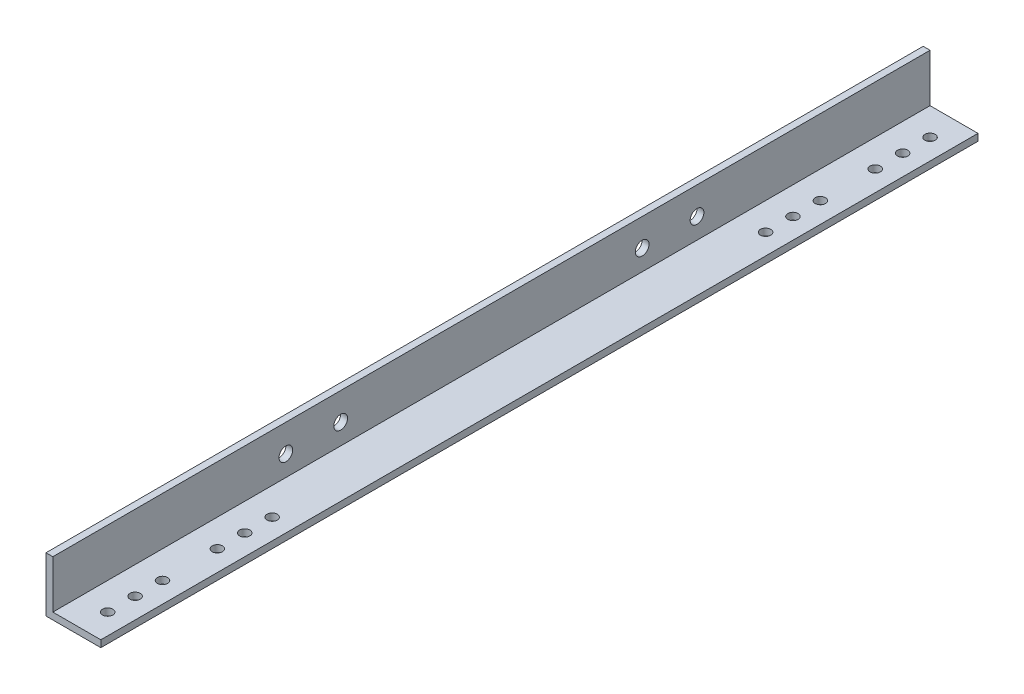
ISO-10303-21;
HEADER;
FILE_DESCRIPTION(('STEP AP214'),'2;1');
FILE_NAME('part.step','',(''),(''),'','','');
FILE_SCHEMA(('AUTOMOTIVE_DESIGN { 1 0 10303 214 1 1 1 1 }'));
ENDSEC;
DATA;
#1=APPLICATION_CONTEXT('core data for automotive mechanical design processes');
#2=APPLICATION_PROTOCOL_DEFINITION('international standard','automotive_design',2000,#1);
#3=PRODUCT_CONTEXT('',#1,'mechanical');
#4=PRODUCT('Part','Part','',(#3));
#5=PRODUCT_RELATED_PRODUCT_CATEGORY('part','',(#4));
#6=PRODUCT_DEFINITION_FORMATION('','',#4);
#7=PRODUCT_DEFINITION_CONTEXT('part definition',#1,'design');
#8=PRODUCT_DEFINITION('design','',#6,#7);
#9=PRODUCT_DEFINITION_SHAPE('','',#8);
#10=(LENGTH_UNIT() NAMED_UNIT(*) SI_UNIT(.MILLI.,.METRE.));
#11=(NAMED_UNIT(*) PLANE_ANGLE_UNIT() SI_UNIT($,.RADIAN.));
#12=(NAMED_UNIT(*) SI_UNIT($,.STERADIAN.) SOLID_ANGLE_UNIT());
#13=UNCERTAINTY_MEASURE_WITH_UNIT(LENGTH_MEASURE(1.E-05),#10,'distance_accuracy_value','');
#14=(GEOMETRIC_REPRESENTATION_CONTEXT(3) GLOBAL_UNCERTAINTY_ASSIGNED_CONTEXT((#13)) GLOBAL_UNIT_ASSIGNED_CONTEXT((#10,
#11,#12)) REPRESENTATION_CONTEXT('',''));
#15=CARTESIAN_POINT('',(0.,0.,0.));
#16=DIRECTION('',(0.,0.,1.));
#17=DIRECTION('',(1.,0.,0.));
#18=AXIS2_PLACEMENT_3D('',#15,#16,#17);
#19=CARTESIAN_POINT('',(15.875,0.,381.));
#20=DIRECTION('',(0.,1.,0.));
#21=DIRECTION('',(-1.,0.,0.));
#22=AXIS2_PLACEMENT_3D('',#19,#20,#21);
#23=CYLINDRICAL_SURFACE('',#22,2.38125000000002);
#24=CARTESIAN_POINT('',(15.875,0.,381.));
#25=DIRECTION('',(0.,1.,0.));
#26=DIRECTION('',(-1.,0.,0.));
#27=AXIS2_PLACEMENT_3D('',#24,#25,#26);
#28=CIRCLE('',#27,2.38125000000002);
#29=CARTESIAN_POINT('',(13.49375,0.,381.));
#30=VERTEX_POINT('',#29);
#31=EDGE_CURVE('E161',#30,#30,#28,.F.);
#32=ORIENTED_EDGE('',*,*,#31,.T.);
#33=EDGE_LOOP('',(#32));
#34=FACE_BOUND('',#33,.T.);
#35=CARTESIAN_POINT('',(15.875,3.17499999999999,381.));
#36=DIRECTION('',(0.,1.,0.));
#37=DIRECTION('',(-1.,0.,0.));
#38=AXIS2_PLACEMENT_3D('',#35,#36,#37);
#39=CIRCLE('',#38,2.38125000000002);
#40=CARTESIAN_POINT('',(13.49375,3.17499999999999,381.));
#41=VERTEX_POINT('',#40);
#42=EDGE_CURVE('E20',#41,#41,#39,.T.);
#43=ORIENTED_EDGE('',*,*,#42,.T.);
#44=EDGE_LOOP('',(#43));
#45=FACE_BOUND('',#44,.T.);
#46=ADVANCED_FACE('F17',(#34,#45),#23,.F.);
#47=CARTESIAN_POINT('',(15.875,0.,342.9));
#48=DIRECTION('',(0.,1.,0.));
#49=DIRECTION('',(-1.,0.,0.));
#50=AXIS2_PLACEMENT_3D('',#47,#48,#49);
#51=CYLINDRICAL_SURFACE('',#50,2.38125000000002);
#52=CARTESIAN_POINT('',(15.875,3.17499999999999,342.9));
#53=DIRECTION('',(0.,1.,0.));
#54=DIRECTION('',(-1.,0.,0.));
#55=AXIS2_PLACEMENT_3D('',#52,#53,#54);
#56=CIRCLE('',#55,2.38125000000002);
#57=CARTESIAN_POINT('',(13.49375,3.17499999999999,342.9));
#58=VERTEX_POINT('',#57);
#59=EDGE_CURVE('E190',#58,#58,#56,.T.);
#60=ORIENTED_EDGE('',*,*,#59,.T.);
#61=EDGE_LOOP('',(#60));
#62=FACE_BOUND('',#61,.T.);
#63=CARTESIAN_POINT('',(15.875,0.,342.9));
#64=DIRECTION('',(0.,1.,0.));
#65=DIRECTION('',(-1.,0.,0.));
#66=AXIS2_PLACEMENT_3D('',#63,#64,#65);
#67=CIRCLE('',#66,2.38125000000002);
#68=CARTESIAN_POINT('',(13.49375,0.,342.9));
#69=VERTEX_POINT('',#68);
#70=EDGE_CURVE('E158',#69,#69,#67,.F.);
#71=ORIENTED_EDGE('',*,*,#70,.T.);
#72=EDGE_LOOP('',(#71));
#73=FACE_BOUND('',#72,.T.);
#74=ADVANCED_FACE('F291',(#62,#73),#51,.F.);
#75=CARTESIAN_POINT('',(15.875,0.,330.2));
#76=DIRECTION('',(0.,1.,0.));
#77=DIRECTION('',(-1.,0.,0.));
#78=AXIS2_PLACEMENT_3D('',#75,#76,#77);
#79=CYLINDRICAL_SURFACE('',#78,2.38125000000002);
#80=CARTESIAN_POINT('',(15.875,3.17499999999999,330.2));
#81=DIRECTION('',(0.,1.,0.));
#82=DIRECTION('',(-1.,0.,0.));
#83=AXIS2_PLACEMENT_3D('',#80,#81,#82);
#84=CIRCLE('',#83,2.38125000000002);
#85=CARTESIAN_POINT('',(13.49375,3.17499999999999,330.2));
#86=VERTEX_POINT('',#85);
#87=EDGE_CURVE('E188',#86,#86,#84,.T.);
#88=ORIENTED_EDGE('',*,*,#87,.T.);
#89=EDGE_LOOP('',(#88));
#90=FACE_BOUND('',#89,.T.);
#91=CARTESIAN_POINT('',(15.875,0.,330.2));
#92=DIRECTION('',(0.,1.,0.));
#93=DIRECTION('',(-1.,0.,0.));
#94=AXIS2_PLACEMENT_3D('',#91,#92,#93);
#95=CIRCLE('',#94,2.38125000000002);
#96=CARTESIAN_POINT('',(13.49375,0.,330.2));
#97=VERTEX_POINT('',#96);
#98=EDGE_CURVE('E155',#97,#97,#95,.F.);
#99=ORIENTED_EDGE('',*,*,#98,.T.);
#100=EDGE_LOOP('',(#99));
#101=FACE_BOUND('',#100,.T.);
#102=ADVANCED_FACE('F295',(#90,#101),#79,.F.);
#103=CARTESIAN_POINT('',(15.875,0.,317.5));
#104=DIRECTION('',(0.,1.,0.));
#105=DIRECTION('',(-1.,0.,0.));
#106=AXIS2_PLACEMENT_3D('',#103,#104,#105);
#107=CYLINDRICAL_SURFACE('',#106,2.38125000000003);
#108=CARTESIAN_POINT('',(15.875,3.17499999999999,317.5));
#109=DIRECTION('',(0.,1.,0.));
#110=DIRECTION('',(-1.,0.,0.));
#111=AXIS2_PLACEMENT_3D('',#108,#109,#110);
#112=CIRCLE('',#111,2.38125000000003);
#113=CARTESIAN_POINT('',(13.49375,3.17499999999999,317.5));
#114=VERTEX_POINT('',#113);
#115=EDGE_CURVE('E185',#114,#114,#112,.T.);
#116=ORIENTED_EDGE('',*,*,#115,.T.);
#117=EDGE_LOOP('',(#116));
#118=FACE_BOUND('',#117,.T.);
#119=CARTESIAN_POINT('',(15.875,0.,317.5));
#120=DIRECTION('',(0.,1.,0.));
#121=DIRECTION('',(-1.,0.,0.));
#122=AXIS2_PLACEMENT_3D('',#119,#120,#121);
#123=CIRCLE('',#122,2.38125000000003);
#124=CARTESIAN_POINT('',(13.49375,0.,317.5));
#125=VERTEX_POINT('',#124);
#126=EDGE_CURVE('E152',#125,#125,#123,.F.);
#127=ORIENTED_EDGE('',*,*,#126,.T.);
#128=EDGE_LOOP('',(#127));
#129=FACE_BOUND('',#128,.T.);
#130=ADVANCED_FACE('F299',(#118,#129),#107,.F.);
#131=CARTESIAN_POINT('',(15.875,0.,76.2));
#132=DIRECTION('',(0.,1.,0.));
#133=DIRECTION('',(-1.,0.,0.));
#134=AXIS2_PLACEMENT_3D('',#131,#132,#133);
#135=CYLINDRICAL_SURFACE('',#134,2.38125);
#136=CARTESIAN_POINT('',(15.875,0.,76.2));
#137=DIRECTION('',(0.,1.,0.));
#138=DIRECTION('',(-1.,0.,0.));
#139=AXIS2_PLACEMENT_3D('',#136,#137,#138);
#140=CIRCLE('',#139,2.38125);
#141=CARTESIAN_POINT('',(13.49375,0.,76.2));
#142=VERTEX_POINT('',#141);
#143=EDGE_CURVE('E149',#142,#142,#140,.F.);
#144=ORIENTED_EDGE('',*,*,#143,.T.);
#145=EDGE_LOOP('',(#144));
#146=FACE_BOUND('',#145,.T.);
#147=CARTESIAN_POINT('',(15.875,3.17499999999999,76.2));
#148=DIRECTION('',(0.,1.,0.));
#149=DIRECTION('',(-1.,0.,0.));
#150=AXIS2_PLACEMENT_3D('',#147,#148,#149);
#151=CIRCLE('',#150,2.38125);
#152=CARTESIAN_POINT('',(13.49375,3.17499999999999,76.2));
#153=VERTEX_POINT('',#152);
#154=EDGE_CURVE('E88',#153,#153,#151,.T.);
#155=ORIENTED_EDGE('',*,*,#154,.T.);
#156=EDGE_LOOP('',(#155));
#157=FACE_BOUND('',#156,.T.);
#158=ADVANCED_FACE('F306',(#146,#157),#135,.F.);
#159=CARTESIAN_POINT('',(15.875,0.,393.7));
#160=DIRECTION('',(0.,1.,0.));
#161=DIRECTION('',(-1.,0.,0.));
#162=AXIS2_PLACEMENT_3D('',#159,#160,#161);
#163=CYLINDRICAL_SURFACE('',#162,2.38125000000003);
#164=CARTESIAN_POINT('',(15.875,0.,393.7));
#165=DIRECTION('',(0.,1.,0.));
#166=DIRECTION('',(-1.,0.,0.));
#167=AXIS2_PLACEMENT_3D('',#164,#165,#166);
#168=CIRCLE('',#167,2.38125000000003);
#169=CARTESIAN_POINT('',(13.49375,0.,393.7));
#170=VERTEX_POINT('',#169);
#171=EDGE_CURVE('E145',#170,#170,#168,.F.);
#172=ORIENTED_EDGE('',*,*,#171,.T.);
#173=EDGE_LOOP('',(#172));
#174=FACE_BOUND('',#173,.T.);
#175=CARTESIAN_POINT('',(15.875,3.17499999999999,393.7));
#176=DIRECTION('',(0.,1.,0.));
#177=DIRECTION('',(-1.,0.,0.));
#178=AXIS2_PLACEMENT_3D('',#175,#176,#177);
#179=CIRCLE('',#178,2.38125000000003);
#180=CARTESIAN_POINT('',(13.49375,3.17499999999999,393.7));
#181=VERTEX_POINT('',#180);
#182=EDGE_CURVE('E87',#181,#181,#179,.T.);
#183=ORIENTED_EDGE('',*,*,#182,.T.);
#184=EDGE_LOOP('',(#183));
#185=FACE_BOUND('',#184,.T.);
#186=ADVANCED_FACE('F310',(#174,#185),#163,.F.);
#187=CARTESIAN_POINT('',(15.875,0.,12.7));
#188=DIRECTION('',(0.,1.,0.));
#189=DIRECTION('',(-1.,0.,0.));
#190=AXIS2_PLACEMENT_3D('',#187,#188,#189);
#191=CYLINDRICAL_SURFACE('',#190,2.38125000000001);
#192=CARTESIAN_POINT('',(15.875,3.17499999999999,12.7));
#193=DIRECTION('',(0.,1.,0.));
#194=DIRECTION('',(-1.,0.,0.));
#195=AXIS2_PLACEMENT_3D('',#192,#193,#194);
#196=CIRCLE('',#195,2.38125000000001);
#197=CARTESIAN_POINT('',(13.49375,3.17499999999999,12.7));
#198=VERTEX_POINT('',#197);
#199=EDGE_CURVE('E178',#198,#198,#196,.T.);
#200=ORIENTED_EDGE('',*,*,#199,.T.);
#201=EDGE_LOOP('',(#200));
#202=FACE_BOUND('',#201,.T.);
#203=CARTESIAN_POINT('',(15.875,0.,12.7));
#204=DIRECTION('',(0.,1.,0.));
#205=DIRECTION('',(-1.,0.,0.));
#206=AXIS2_PLACEMENT_3D('',#203,#204,#205);
#207=CIRCLE('',#206,2.38125000000001);
#208=CARTESIAN_POINT('',(13.49375,0.,12.7));
#209=VERTEX_POINT('',#208);
#210=EDGE_CURVE('E142',#209,#209,#207,.F.);
#211=ORIENTED_EDGE('',*,*,#210,.T.);
#212=EDGE_LOOP('',(#211));
#213=FACE_BOUND('',#212,.T.);
#214=ADVANCED_FACE('F314',(#202,#213),#191,.F.);
#215=CARTESIAN_POINT('',(15.875,0.,25.4));
#216=DIRECTION('',(0.,1.,0.));
#217=DIRECTION('',(-1.,0.,0.));
#218=AXIS2_PLACEMENT_3D('',#215,#216,#217);
#219=CYLINDRICAL_SURFACE('',#218,2.38125);
#220=CARTESIAN_POINT('',(15.875,3.17499999999999,25.4));
#221=DIRECTION('',(0.,1.,0.));
#222=DIRECTION('',(-1.,0.,0.));
#223=AXIS2_PLACEMENT_3D('',#220,#221,#222);
#224=CIRCLE('',#223,2.38125);
#225=CARTESIAN_POINT('',(13.49375,3.17499999999999,25.4));
#226=VERTEX_POINT('',#225);
#227=EDGE_CURVE('E175',#226,#226,#224,.T.);
#228=ORIENTED_EDGE('',*,*,#227,.T.);
#229=EDGE_LOOP('',(#228));
#230=FACE_BOUND('',#229,.T.);
#231=CARTESIAN_POINT('',(15.875,0.,25.4));
#232=DIRECTION('',(0.,1.,0.));
#233=DIRECTION('',(-1.,0.,0.));
#234=AXIS2_PLACEMENT_3D('',#231,#232,#233);
#235=CIRCLE('',#234,2.38125);
#236=CARTESIAN_POINT('',(13.49375,0.,25.4));
#237=VERTEX_POINT('',#236);
#238=EDGE_CURVE('E139',#237,#237,#235,.F.);
#239=ORIENTED_EDGE('',*,*,#238,.T.);
#240=EDGE_LOOP('',(#239));
#241=FACE_BOUND('',#240,.T.);
#242=ADVANCED_FACE('F318',(#230,#241),#219,.F.);
#243=CARTESIAN_POINT('',(15.875,0.,38.1));
#244=DIRECTION('',(0.,1.,0.));
#245=DIRECTION('',(-1.,0.,0.));
#246=AXIS2_PLACEMENT_3D('',#243,#244,#245);
#247=CYLINDRICAL_SURFACE('',#246,2.38125000000001);
#248=CARTESIAN_POINT('',(15.875,3.17499999999999,38.1));
#249=DIRECTION('',(0.,1.,0.));
#250=DIRECTION('',(-1.,0.,0.));
#251=AXIS2_PLACEMENT_3D('',#248,#249,#250);
#252=CIRCLE('',#251,2.38125000000001);
#253=CARTESIAN_POINT('',(13.49375,3.17499999999999,38.1));
#254=VERTEX_POINT('',#253);
#255=EDGE_CURVE('E172',#254,#254,#252,.T.);
#256=ORIENTED_EDGE('',*,*,#255,.T.);
#257=EDGE_LOOP('',(#256));
#258=FACE_BOUND('',#257,.T.);
#259=CARTESIAN_POINT('',(15.875,0.,38.1));
#260=DIRECTION('',(0.,1.,0.));
#261=DIRECTION('',(-1.,0.,0.));
#262=AXIS2_PLACEMENT_3D('',#259,#260,#261);
#263=CIRCLE('',#262,2.38125000000001);
#264=CARTESIAN_POINT('',(13.49375,0.,38.1));
#265=VERTEX_POINT('',#264);
#266=EDGE_CURVE('E136',#265,#265,#263,.F.);
#267=ORIENTED_EDGE('',*,*,#266,.T.);
#268=EDGE_LOOP('',(#267));
#269=FACE_BOUND('',#268,.T.);
#270=ADVANCED_FACE('F322',(#258,#269),#247,.F.);
#271=CARTESIAN_POINT('',(15.875,0.,63.5000000000001));
#272=DIRECTION('',(0.,1.,0.));
#273=DIRECTION('',(-1.,0.,0.));
#274=AXIS2_PLACEMENT_3D('',#271,#272,#273);
#275=CYLINDRICAL_SURFACE('',#274,2.38125);
#276=CARTESIAN_POINT('',(15.875,0.,63.5000000000001));
#277=DIRECTION('',(0.,1.,0.));
#278=DIRECTION('',(-1.,0.,0.));
#279=AXIS2_PLACEMENT_3D('',#276,#277,#278);
#280=CIRCLE('',#279,2.38125);
#281=CARTESIAN_POINT('',(13.49375,0.,63.5000000000001));
#282=VERTEX_POINT('',#281);
#283=EDGE_CURVE('E133',#282,#282,#280,.F.);
#284=ORIENTED_EDGE('',*,*,#283,.T.);
#285=EDGE_LOOP('',(#284));
#286=FACE_BOUND('',#285,.T.);
#287=CARTESIAN_POINT('',(15.875,3.17499999999999,63.5000000000001));
#288=DIRECTION('',(0.,1.,0.));
#289=DIRECTION('',(-1.,0.,0.));
#290=AXIS2_PLACEMENT_3D('',#287,#288,#289);
#291=CIRCLE('',#290,2.38125);
#292=CARTESIAN_POINT('',(13.49375,3.17499999999999,63.5000000000001));
#293=VERTEX_POINT('',#292);
#294=EDGE_CURVE('E169',#293,#293,#291,.T.);
#295=ORIENTED_EDGE('',*,*,#294,.T.);
#296=EDGE_LOOP('',(#295));
#297=FACE_BOUND('',#296,.T.);
#298=ADVANCED_FACE('F326',(#286,#297),#275,.F.);
#299=CARTESIAN_POINT('',(15.875,0.,88.9));
#300=DIRECTION('',(0.,1.,0.));
#301=DIRECTION('',(-1.,0.,0.));
#302=AXIS2_PLACEMENT_3D('',#299,#300,#301);
#303=CYLINDRICAL_SURFACE('',#302,2.38125000000001);
#304=CARTESIAN_POINT('',(15.875,0.,88.9));
#305=DIRECTION('',(0.,1.,0.));
#306=DIRECTION('',(-1.,0.,0.));
#307=AXIS2_PLACEMENT_3D('',#304,#305,#306);
#308=CIRCLE('',#307,2.38125000000001);
#309=CARTESIAN_POINT('',(13.49375,0.,88.9));
#310=VERTEX_POINT('',#309);
#311=EDGE_CURVE('E130',#310,#310,#308,.F.);
#312=ORIENTED_EDGE('',*,*,#311,.T.);
#313=EDGE_LOOP('',(#312));
#314=FACE_BOUND('',#313,.T.);
#315=CARTESIAN_POINT('',(15.875,3.17499999999999,88.9));
#316=DIRECTION('',(0.,1.,0.));
#317=DIRECTION('',(-1.,0.,0.));
#318=AXIS2_PLACEMENT_3D('',#315,#316,#317);
#319=CIRCLE('',#318,2.38125000000001);
#320=CARTESIAN_POINT('',(13.49375,3.17499999999999,88.9));
#321=VERTEX_POINT('',#320);
#322=EDGE_CURVE('E166',#321,#321,#319,.T.);
#323=ORIENTED_EDGE('',*,*,#322,.T.);
#324=EDGE_LOOP('',(#323));
#325=FACE_BOUND('',#324,.T.);
#326=ADVANCED_FACE('F330',(#314,#325),#303,.F.);
#327=CARTESIAN_POINT('',(15.875,0.,368.3));
#328=DIRECTION('',(0.,1.,0.));
#329=DIRECTION('',(-1.,0.,0.));
#330=AXIS2_PLACEMENT_3D('',#327,#328,#329);
#331=CYLINDRICAL_SURFACE('',#330,2.38125000000002);
#332=CARTESIAN_POINT('',(15.875,0.,368.3));
#333=DIRECTION('',(0.,1.,0.));
#334=DIRECTION('',(-1.,0.,0.));
#335=AXIS2_PLACEMENT_3D('',#332,#333,#334);
#336=CIRCLE('',#335,2.38125000000002);
#337=CARTESIAN_POINT('',(13.49375,0.,368.3));
#338=VERTEX_POINT('',#337);
#339=EDGE_CURVE('E127',#338,#338,#336,.F.);
#340=ORIENTED_EDGE('',*,*,#339,.T.);
#341=EDGE_LOOP('',(#340));
#342=FACE_BOUND('',#341,.T.);
#343=CARTESIAN_POINT('',(15.875,3.17499999999999,368.3));
#344=DIRECTION('',(0.,1.,0.));
#345=DIRECTION('',(-1.,0.,0.));
#346=AXIS2_PLACEMENT_3D('',#343,#344,#345);
#347=CIRCLE('',#346,2.38125000000002);
#348=CARTESIAN_POINT('',(13.49375,3.17499999999999,368.3));
#349=VERTEX_POINT('',#348);
#350=EDGE_CURVE('E102',#349,#349,#347,.T.);
#351=ORIENTED_EDGE('',*,*,#350,.T.);
#352=EDGE_LOOP('',(#351));
#353=FACE_BOUND('',#352,.T.);
#354=ADVANCED_FACE('F210',(#342,#353),#331,.F.);
#355=CARTESIAN_POINT('',(25.4,0.,406.4));
#356=DIRECTION('',(-1.,0.,0.));
#357=DIRECTION('',(0.,0.,1.));
#358=AXIS2_PLACEMENT_3D('',#355,#356,#357);
#359=PLANE('',#358);
#360=DIRECTION('',(0.,0.,1.));
#361=VECTOR('',#360,1.);
#362=CARTESIAN_POINT('',(25.4,3.175,406.4));
#363=LINE('',#362,#361);
#364=CARTESIAN_POINT('',(25.4,3.175,0.));
#365=VERTEX_POINT('',#364);
#366=CARTESIAN_POINT('',(25.4,3.175,406.4));
#367=VERTEX_POINT('',#366);
#368=EDGE_CURVE('E81',#365,#367,#363,.T.);
#369=ORIENTED_EDGE('',*,*,#368,.T.);
#370=DIRECTION('',(0.,1.,0.));
#371=VECTOR('',#370,1.);
#372=CARTESIAN_POINT('',(25.4,0.,406.4));
#373=LINE('',#372,#371);
#374=CARTESIAN_POINT('',(25.4,0.,406.4));
#375=VERTEX_POINT('',#374);
#376=EDGE_CURVE('E71',#375,#367,#373,.T.);
#377=ORIENTED_EDGE('',*,*,#376,.F.);
#378=DIRECTION('',(0.,0.,1.));
#379=VECTOR('',#378,1.);
#380=CARTESIAN_POINT('',(25.4,0.,406.4));
#381=LINE('',#380,#379);
#382=CARTESIAN_POINT('',(25.4,0.,0.));
#383=VERTEX_POINT('',#382);
#384=EDGE_CURVE('E148',#375,#383,#381,.F.);
#385=ORIENTED_EDGE('',*,*,#384,.T.);
#386=DIRECTION('',(0.,1.,0.));
#387=VECTOR('',#386,1.);
#388=CARTESIAN_POINT('',(25.4,0.,0.));
#389=LINE('',#388,#387);
#390=EDGE_CURVE('E83',#383,#365,#389,.T.);
#391=ORIENTED_EDGE('',*,*,#390,.T.);
#392=EDGE_LOOP('',(#369,#377,#385,#391));
#393=FACE_BOUND('',#392,.T.);
#394=ADVANCED_FACE('F82',(#393),#359,.F.);
#395=CARTESIAN_POINT('',(25.4,3.175,406.4));
#396=DIRECTION('',(0.,-1.,0.));
#397=DIRECTION('',(1.,0.,0.));
#398=AXIS2_PLACEMENT_3D('',#395,#396,#397);
#399=PLANE('',#398);
#400=ORIENTED_EDGE('',*,*,#350,.F.);
#401=EDGE_LOOP('',(#400));
#402=FACE_BOUND('',#401,.T.);
#403=ORIENTED_EDGE('',*,*,#322,.F.);
#404=EDGE_LOOP('',(#403));
#405=FACE_BOUND('',#404,.T.);
#406=ORIENTED_EDGE('',*,*,#294,.F.);
#407=EDGE_LOOP('',(#406));
#408=FACE_BOUND('',#407,.T.);
#409=ORIENTED_EDGE('',*,*,#255,.F.);
#410=EDGE_LOOP('',(#409));
#411=FACE_BOUND('',#410,.T.);
#412=ORIENTED_EDGE('',*,*,#227,.F.);
#413=EDGE_LOOP('',(#412));
#414=FACE_BOUND('',#413,.T.);
#415=ORIENTED_EDGE('',*,*,#199,.F.);
#416=EDGE_LOOP('',(#415));
#417=FACE_BOUND('',#416,.T.);
#418=ORIENTED_EDGE('',*,*,#182,.F.);
#419=EDGE_LOOP('',(#418));
#420=FACE_BOUND('',#419,.T.);
#421=DIRECTION('',(0.,0.,1.));
#422=VECTOR('',#421,1.);
#423=CARTESIAN_POINT('',(3.175,3.17499999999999,406.4));
#424=LINE('',#423,#422);
#425=CARTESIAN_POINT('',(3.175,3.175,0.));
#426=VERTEX_POINT('',#425);
#427=CARTESIAN_POINT('',(3.175,3.175,406.4));
#428=VERTEX_POINT('',#427);
#429=EDGE_CURVE('E92',#426,#428,#424,.T.);
#430=ORIENTED_EDGE('',*,*,#429,.T.);
#431=DIRECTION('',(1.,0.,0.));
#432=VECTOR('',#431,1.);
#433=CARTESIAN_POINT('',(0.,3.175,406.4));
#434=LINE('',#433,#432);
#435=EDGE_CURVE('E68',#367,#428,#434,.F.);
#436=ORIENTED_EDGE('',*,*,#435,.F.);
#437=ORIENTED_EDGE('',*,*,#368,.F.);
#438=DIRECTION('',(1.,0.,0.));
#439=VECTOR('',#438,1.);
#440=CARTESIAN_POINT('',(0.,3.175,0.));
#441=LINE('',#440,#439);
#442=EDGE_CURVE('E268',#365,#426,#441,.F.);
#443=ORIENTED_EDGE('',*,*,#442,.T.);
#444=EDGE_LOOP('',(#430,#436,#437,#443));
#445=FACE_BOUND('',#444,.T.);
#446=ORIENTED_EDGE('',*,*,#154,.F.);
#447=EDGE_LOOP('',(#446));
#448=FACE_BOUND('',#447,.T.);
#449=ORIENTED_EDGE('',*,*,#115,.F.);
#450=EDGE_LOOP('',(#449));
#451=FACE_BOUND('',#450,.T.);
#452=ORIENTED_EDGE('',*,*,#87,.F.);
#453=EDGE_LOOP('',(#452));
#454=FACE_BOUND('',#453,.T.);
#455=ORIENTED_EDGE('',*,*,#59,.F.);
#456=EDGE_LOOP('',(#455));
#457=FACE_BOUND('',#456,.T.);
#458=ORIENTED_EDGE('',*,*,#42,.F.);
#459=EDGE_LOOP('',(#458));
#460=FACE_BOUND('',#459,.T.);
#461=ADVANCED_FACE('F90',(#402,#405,#408,#411,#414,#417,#420,#445,#448,#451,#454,#457,#460),
#399,.F.);
#462=CARTESIAN_POINT('',(3.175,3.17499999999999,406.4));
#463=DIRECTION('',(-1.,0.,0.));
#464=DIRECTION('',(0.,-1.,0.));
#465=AXIS2_PLACEMENT_3D('',#462,#463,#464);
#466=PLANE('',#465);
#467=CARTESIAN_POINT('',(3.175,12.7,133.35));
#468=DIRECTION('',(-1.,0.,0.));
#469=DIRECTION('',(0.,0.,1.));
#470=AXIS2_PLACEMENT_3D('',#467,#468,#469);
#471=CIRCLE('',#470,3.17500000000001);
#472=CARTESIAN_POINT('',(3.175,12.7,136.525));
#473=VERTEX_POINT('',#472);
#474=EDGE_CURVE('E113',#473,#473,#471,.T.);
#475=ORIENTED_EDGE('',*,*,#474,.T.);
#476=EDGE_LOOP('',(#475));
#477=FACE_BOUND('',#476,.T.);
#478=CARTESIAN_POINT('',(3.175,12.7,298.45));
#479=DIRECTION('',(-1.,0.,0.));
#480=DIRECTION('',(0.,0.,1.));
#481=AXIS2_PLACEMENT_3D('',#478,#479,#480);
#482=CIRCLE('',#481,3.17500000000004);
#483=CARTESIAN_POINT('',(3.175,12.7,301.625));
#484=VERTEX_POINT('',#483);
#485=EDGE_CURVE('E117',#484,#484,#482,.T.);
#486=ORIENTED_EDGE('',*,*,#485,.T.);
#487=EDGE_LOOP('',(#486));
#488=FACE_BOUND('',#487,.T.);
#489=CARTESIAN_POINT('',(3.175,12.7,273.05));
#490=DIRECTION('',(-1.,0.,0.));
#491=DIRECTION('',(0.,0.,1.));
#492=AXIS2_PLACEMENT_3D('',#489,#490,#491);
#493=CIRCLE('',#492,3.17500000000004);
#494=CARTESIAN_POINT('',(3.175,12.7,276.225));
#495=VERTEX_POINT('',#494);
#496=EDGE_CURVE('E120',#495,#495,#493,.T.);
#497=ORIENTED_EDGE('',*,*,#496,.T.);
#498=EDGE_LOOP('',(#497));
#499=FACE_BOUND('',#498,.T.);
#500=CARTESIAN_POINT('',(3.175,12.7,107.95));
#501=DIRECTION('',(-1.,0.,0.));
#502=DIRECTION('',(0.,0.,1.));
#503=AXIS2_PLACEMENT_3D('',#500,#501,#502);
#504=CIRCLE('',#503,3.175);
#505=CARTESIAN_POINT('',(3.175,12.7,111.125));
#506=VERTEX_POINT('',#505);
#507=EDGE_CURVE('E123',#506,#506,#504,.T.);
#508=ORIENTED_EDGE('',*,*,#507,.T.);
#509=EDGE_LOOP('',(#508));
#510=FACE_BOUND('',#509,.T.);
#511=DIRECTION('',(0.,0.,-1.));
#512=VECTOR('',#511,1.);
#513=CARTESIAN_POINT('',(3.175,25.4,406.4));
#514=LINE('',#513,#512);
#515=CARTESIAN_POINT('',(3.175,25.4,0.));
#516=VERTEX_POINT('',#515);
#517=CARTESIAN_POINT('',(3.175,25.4,406.4));
#518=VERTEX_POINT('',#517);
#519=EDGE_CURVE('E78',#516,#518,#514,.F.);
#520=ORIENTED_EDGE('',*,*,#519,.T.);
#521=DIRECTION('',(0.,1.,0.));
#522=VECTOR('',#521,1.);
#523=CARTESIAN_POINT('',(3.175,0.,406.4));
#524=LINE('',#523,#522);
#525=EDGE_CURVE('E94',#428,#518,#524,.T.);
#526=ORIENTED_EDGE('',*,*,#525,.F.);
#527=ORIENTED_EDGE('',*,*,#429,.F.);
#528=DIRECTION('',(0.,1.,0.));
#529=VECTOR('',#528,1.);
#530=CARTESIAN_POINT('',(3.175,0.,0.));
#531=LINE('',#530,#529);
#532=EDGE_CURVE('E265',#426,#516,#531,.T.);
#533=ORIENTED_EDGE('',*,*,#532,.T.);
#534=EDGE_LOOP('',(#520,#526,#527,#533));
#535=FACE_BOUND('',#534,.T.);
#536=ADVANCED_FACE('F199',(#477,#488,#499,#510,#535),#466,.F.);
#537=CARTESIAN_POINT('',(3.175,25.4,406.4));
#538=DIRECTION('',(0.,-1.,0.));
#539=DIRECTION('',(0.,0.,-1.));
#540=AXIS2_PLACEMENT_3D('',#537,#538,#539);
#541=PLANE('',#540);
#542=DIRECTION('',(0.,0.,1.));
#543=VECTOR('',#542,1.);
#544=CARTESIAN_POINT('',(0.,25.4,406.4));
#545=LINE('',#544,#543);
#546=CARTESIAN_POINT('',(0.,25.4,0.));
#547=VERTEX_POINT('',#546);
#548=CARTESIAN_POINT('',(0.,25.4,406.4));
#549=VERTEX_POINT('',#548);
#550=EDGE_CURVE('E116',#547,#549,#545,.T.);
#551=ORIENTED_EDGE('',*,*,#550,.T.);
#552=DIRECTION('',(1.,0.,0.));
#553=VECTOR('',#552,1.);
#554=CARTESIAN_POINT('',(0.,25.4,406.4));
#555=LINE('',#554,#553);
#556=EDGE_CURVE('E96',#518,#549,#555,.F.);
#557=ORIENTED_EDGE('',*,*,#556,.F.);
#558=ORIENTED_EDGE('',*,*,#519,.F.);
#559=DIRECTION('',(1.,0.,0.));
#560=VECTOR('',#559,1.);
#561=CARTESIAN_POINT('',(0.,25.4,0.));
#562=LINE('',#561,#560);
#563=EDGE_CURVE('E126',#516,#547,#562,.F.);
#564=ORIENTED_EDGE('',*,*,#563,.T.);
#565=EDGE_LOOP('',(#551,#557,#558,#564));
#566=FACE_BOUND('',#565,.T.);
#567=ADVANCED_FACE('F207',(#566),#541,.F.);
#568=CARTESIAN_POINT('',(0.,0.,406.4));
#569=DIRECTION('',(0.,0.,1.));
#570=DIRECTION('',(1.,0.,0.));
#571=AXIS2_PLACEMENT_3D('',#568,#569,#570);
#572=PLANE('',#571);
#573=ORIENTED_EDGE('',*,*,#525,.T.);
#574=ORIENTED_EDGE('',*,*,#556,.T.);
#575=DIRECTION('',(0.,1.,0.));
#576=VECTOR('',#575,1.);
#577=CARTESIAN_POINT('',(0.,25.4,406.4));
#578=LINE('',#577,#576);
#579=CARTESIAN_POINT('',(0.,0.,406.4));
#580=VERTEX_POINT('',#579);
#581=EDGE_CURVE('E258',#549,#580,#578,.F.);
#582=ORIENTED_EDGE('',*,*,#581,.T.);
#583=DIRECTION('',(1.,0.,0.));
#584=VECTOR('',#583,1.);
#585=CARTESIAN_POINT('',(0.,0.,406.4));
#586=LINE('',#585,#584);
#587=EDGE_CURVE('E75',#580,#375,#586,.T.);
#588=ORIENTED_EDGE('',*,*,#587,.T.);
#589=ORIENTED_EDGE('',*,*,#376,.T.);
#590=ORIENTED_EDGE('',*,*,#435,.T.);
#591=EDGE_LOOP('',(#573,#574,#582,#588,#589,#590));
#592=FACE_BOUND('',#591,.T.);
#593=ADVANCED_FACE('F73',(#592),#572,.T.);
#594=CARTESIAN_POINT('',(0.,0.,406.4));
#595=DIRECTION('',(0.,1.,0.));
#596=DIRECTION('',(0.,0.,1.));
#597=AXIS2_PLACEMENT_3D('',#594,#595,#596);
#598=PLANE('',#597);
#599=ORIENTED_EDGE('',*,*,#339,.F.);
#600=EDGE_LOOP('',(#599));
#601=FACE_BOUND('',#600,.T.);
#602=ORIENTED_EDGE('',*,*,#311,.F.);
#603=EDGE_LOOP('',(#602));
#604=FACE_BOUND('',#603,.T.);
#605=ORIENTED_EDGE('',*,*,#283,.F.);
#606=EDGE_LOOP('',(#605));
#607=FACE_BOUND('',#606,.T.);
#608=ORIENTED_EDGE('',*,*,#266,.F.);
#609=EDGE_LOOP('',(#608));
#610=FACE_BOUND('',#609,.T.);
#611=ORIENTED_EDGE('',*,*,#238,.F.);
#612=EDGE_LOOP('',(#611));
#613=FACE_BOUND('',#612,.T.);
#614=ORIENTED_EDGE('',*,*,#210,.F.);
#615=EDGE_LOOP('',(#614));
#616=FACE_BOUND('',#615,.T.);
#617=ORIENTED_EDGE('',*,*,#171,.F.);
#618=EDGE_LOOP('',(#617));
#619=FACE_BOUND('',#618,.T.);
#620=ORIENTED_EDGE('',*,*,#384,.F.);
#621=ORIENTED_EDGE('',*,*,#587,.F.);
#622=DIRECTION('',(0.,0.,1.));
#623=VECTOR('',#622,1.);
#624=CARTESIAN_POINT('',(0.,0.,406.4));
#625=LINE('',#624,#623);
#626=CARTESIAN_POINT('',(0.,0.,0.));
#627=VERTEX_POINT('',#626);
#628=EDGE_CURVE('E260',#580,#627,#625,.F.);
#629=ORIENTED_EDGE('',*,*,#628,.T.);
#630=DIRECTION('',(1.,0.,0.));
#631=VECTOR('',#630,1.);
#632=CARTESIAN_POINT('',(0.,0.,0.));
#633=LINE('',#632,#631);
#634=EDGE_CURVE('E35',#627,#383,#633,.T.);
#635=ORIENTED_EDGE('',*,*,#634,.T.);
#636=EDGE_LOOP('',(#620,#621,#629,#635));
#637=FACE_BOUND('',#636,.T.);
#638=ORIENTED_EDGE('',*,*,#143,.F.);
#639=EDGE_LOOP('',(#638));
#640=FACE_BOUND('',#639,.T.);
#641=ORIENTED_EDGE('',*,*,#126,.F.);
#642=EDGE_LOOP('',(#641));
#643=FACE_BOUND('',#642,.T.);
#644=ORIENTED_EDGE('',*,*,#98,.F.);
#645=EDGE_LOOP('',(#644));
#646=FACE_BOUND('',#645,.T.);
#647=ORIENTED_EDGE('',*,*,#70,.F.);
#648=EDGE_LOOP('',(#647));
#649=FACE_BOUND('',#648,.T.);
#650=ORIENTED_EDGE('',*,*,#31,.F.);
#651=EDGE_LOOP('',(#650));
#652=FACE_BOUND('',#651,.T.);
#653=ADVANCED_FACE('F242',(#601,#604,#607,#610,#613,#616,#619,#637,#640,#643,#646,#649,#652),
#598,.F.);
#654=CARTESIAN_POINT('',(0.,0.,0.));
#655=DIRECTION('',(0.,0.,1.));
#656=DIRECTION('',(1.,0.,0.));
#657=AXIS2_PLACEMENT_3D('',#654,#655,#656);
#658=PLANE('',#657);
#659=ORIENTED_EDGE('',*,*,#563,.F.);
#660=ORIENTED_EDGE('',*,*,#532,.F.);
#661=ORIENTED_EDGE('',*,*,#442,.F.);
#662=ORIENTED_EDGE('',*,*,#390,.F.);
#663=ORIENTED_EDGE('',*,*,#634,.F.);
#664=DIRECTION('',(0.,1.,0.));
#665=VECTOR('',#664,1.);
#666=CARTESIAN_POINT('',(0.,25.4,0.));
#667=LINE('',#666,#665);
#668=EDGE_CURVE('E112',#627,#547,#667,.T.);
#669=ORIENTED_EDGE('',*,*,#668,.T.);
#670=EDGE_LOOP('',(#659,#660,#661,#662,#663,#669));
#671=FACE_BOUND('',#670,.T.);
#672=ADVANCED_FACE('F238',(#671),#658,.F.);
#673=CARTESIAN_POINT('',(25.4,12.7,107.95));
#674=DIRECTION('',(-1.,0.,0.));
#675=DIRECTION('',(0.,0.,1.));
#676=AXIS2_PLACEMENT_3D('',#673,#674,#675);
#677=CYLINDRICAL_SURFACE('',#676,3.175);
#678=ORIENTED_EDGE('',*,*,#507,.F.);
#679=EDGE_LOOP('',(#678));
#680=FACE_BOUND('',#679,.T.);
#681=CARTESIAN_POINT('',(0.,12.7,107.95));
#682=DIRECTION('',(-1.,0.,0.));
#683=DIRECTION('',(0.,0.,1.));
#684=AXIS2_PLACEMENT_3D('',#681,#682,#683);
#685=CIRCLE('',#684,3.175);
#686=CARTESIAN_POINT('',(0.,12.7,111.125));
#687=VERTEX_POINT('',#686);
#688=EDGE_CURVE('E109',#687,#687,#685,.T.);
#689=ORIENTED_EDGE('',*,*,#688,.T.);
#690=EDGE_LOOP('',(#689));
#691=FACE_BOUND('',#690,.T.);
#692=ADVANCED_FACE('F234',(#680,#691),#677,.F.);
#693=CARTESIAN_POINT('',(25.4,12.7,273.05));
#694=DIRECTION('',(-1.,0.,0.));
#695=DIRECTION('',(0.,0.,1.));
#696=AXIS2_PLACEMENT_3D('',#693,#694,#695);
#697=CYLINDRICAL_SURFACE('',#696,3.17500000000004);
#698=CARTESIAN_POINT('',(0.,12.7,273.05));
#699=DIRECTION('',(-1.,0.,0.));
#700=DIRECTION('',(0.,0.,1.));
#701=AXIS2_PLACEMENT_3D('',#698,#699,#700);
#702=CIRCLE('',#701,3.17500000000004);
#703=CARTESIAN_POINT('',(0.,12.7,276.225));
#704=VERTEX_POINT('',#703);
#705=EDGE_CURVE('E106',#704,#704,#702,.T.);
#706=ORIENTED_EDGE('',*,*,#705,.T.);
#707=EDGE_LOOP('',(#706));
#708=FACE_BOUND('',#707,.T.);
#709=ORIENTED_EDGE('',*,*,#496,.F.);
#710=EDGE_LOOP('',(#709));
#711=FACE_BOUND('',#710,.T.);
#712=ADVANCED_FACE('F230',(#708,#711),#697,.F.);
#713=CARTESIAN_POINT('',(25.4,12.7,298.45));
#714=DIRECTION('',(-1.,0.,0.));
#715=DIRECTION('',(0.,0.,1.));
#716=AXIS2_PLACEMENT_3D('',#713,#714,#715);
#717=CYLINDRICAL_SURFACE('',#716,3.17500000000004);
#718=CARTESIAN_POINT('',(0.,12.7,298.45));
#719=DIRECTION('',(-1.,0.,0.));
#720=DIRECTION('',(0.,0.,1.));
#721=AXIS2_PLACEMENT_3D('',#718,#719,#720);
#722=CIRCLE('',#721,3.17500000000004);
#723=CARTESIAN_POINT('',(0.,12.7,301.625));
#724=VERTEX_POINT('',#723);
#725=EDGE_CURVE('E26',#724,#724,#722,.T.);
#726=ORIENTED_EDGE('',*,*,#725,.T.);
#727=EDGE_LOOP('',(#726));
#728=FACE_BOUND('',#727,.T.);
#729=ORIENTED_EDGE('',*,*,#485,.F.);
#730=EDGE_LOOP('',(#729));
#731=FACE_BOUND('',#730,.T.);
#732=ADVANCED_FACE('F222',(#728,#731),#717,.F.);
#733=CARTESIAN_POINT('',(25.4,12.7,133.35));
#734=DIRECTION('',(-1.,0.,0.));
#735=DIRECTION('',(0.,0.,1.));
#736=AXIS2_PLACEMENT_3D('',#733,#734,#735);
#737=CYLINDRICAL_SURFACE('',#736,3.17500000000001);
#738=ORIENTED_EDGE('',*,*,#474,.F.);
#739=EDGE_LOOP('',(#738));
#740=FACE_BOUND('',#739,.T.);
#741=CARTESIAN_POINT('',(0.,12.7,133.35));
#742=DIRECTION('',(-1.,0.,0.));
#743=DIRECTION('',(0.,0.,1.));
#744=AXIS2_PLACEMENT_3D('',#741,#742,#743);
#745=CIRCLE('',#744,3.17500000000001);
#746=CARTESIAN_POINT('',(0.,12.7,136.525));
#747=VERTEX_POINT('',#746);
#748=EDGE_CURVE('E11',#747,#747,#745,.T.);
#749=ORIENTED_EDGE('',*,*,#748,.T.);
#750=EDGE_LOOP('',(#749));
#751=FACE_BOUND('',#750,.T.);
#752=ADVANCED_FACE('F216',(#740,#751),#737,.F.);
#753=CARTESIAN_POINT('',(0.,25.4,406.4));
#754=DIRECTION('',(1.,0.,0.));
#755=DIRECTION('',(0.,1.,0.));
#756=AXIS2_PLACEMENT_3D('',#753,#754,#755);
#757=PLANE('',#756);
#758=ORIENTED_EDGE('',*,*,#748,.F.);
#759=EDGE_LOOP('',(#758));
#760=FACE_BOUND('',#759,.T.);
#761=ORIENTED_EDGE('',*,*,#725,.F.);
#762=EDGE_LOOP('',(#761));
#763=FACE_BOUND('',#762,.T.);
#764=ORIENTED_EDGE('',*,*,#705,.F.);
#765=EDGE_LOOP('',(#764));
#766=FACE_BOUND('',#765,.T.);
#767=ORIENTED_EDGE('',*,*,#688,.F.);
#768=EDGE_LOOP('',(#767));
#769=FACE_BOUND('',#768,.T.);
#770=ORIENTED_EDGE('',*,*,#628,.F.);
#771=ORIENTED_EDGE('',*,*,#581,.F.);
#772=ORIENTED_EDGE('',*,*,#550,.F.);
#773=ORIENTED_EDGE('',*,*,#668,.F.);
#774=EDGE_LOOP('',(#770,#771,#772,#773));
#775=FACE_BOUND('',#774,.T.);
#776=ADVANCED_FACE('F214',(#760,#763,#766,#769,#775),#757,.F.);
#777=CLOSED_SHELL('',(#46,#74,#102,#130,#158,#186,#214,#242,#270,#298,#326,#354,#394,#461,#536,
#567,#593,#653,#672,#692,#712,#732,#752,#776));
#778=MANIFOLD_SOLID_BREP('B1',#777);
#779=ADVANCED_BREP_SHAPE_REPRESENTATION('',(#18,#778),#14);
#780=SHAPE_DEFINITION_REPRESENTATION(#9,#779);
ENDSEC;
END-ISO-10303-21;
